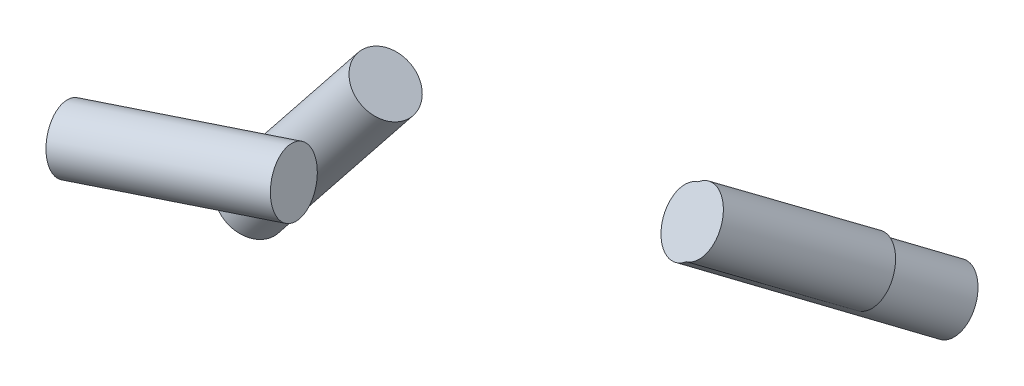
ISO-10303-21;
HEADER;
FILE_DESCRIPTION(('STEP AP214'),'2;1');
FILE_NAME('part.step','',(''),(''),'','','');
FILE_SCHEMA(('AUTOMOTIVE_DESIGN { 1 0 10303 214 1 1 1 1 }'));
ENDSEC;
DATA;
#1=APPLICATION_CONTEXT('core data for automotive mechanical design processes');
#2=APPLICATION_PROTOCOL_DEFINITION('international standard','automotive_design',2000,#1);
#3=PRODUCT_CONTEXT('',#1,'mechanical');
#4=PRODUCT('Part','Part','',(#3));
#5=PRODUCT_RELATED_PRODUCT_CATEGORY('part','',(#4));
#6=PRODUCT_DEFINITION_FORMATION('','',#4);
#7=PRODUCT_DEFINITION_CONTEXT('part definition',#1,'design');
#8=PRODUCT_DEFINITION('design','',#6,#7);
#9=PRODUCT_DEFINITION_SHAPE('','',#8);
#10=(LENGTH_UNIT() NAMED_UNIT(*) SI_UNIT(.MILLI.,.METRE.));
#11=(NAMED_UNIT(*) PLANE_ANGLE_UNIT() SI_UNIT($,.RADIAN.));
#12=(NAMED_UNIT(*) SI_UNIT($,.STERADIAN.) SOLID_ANGLE_UNIT());
#13=UNCERTAINTY_MEASURE_WITH_UNIT(LENGTH_MEASURE(1.E-05),#10,'distance_accuracy_value','');
#14=(GEOMETRIC_REPRESENTATION_CONTEXT(3) GLOBAL_UNCERTAINTY_ASSIGNED_CONTEXT((#13)) GLOBAL_UNIT_ASSIGNED_CONTEXT((#10,
#11,#12)) REPRESENTATION_CONTEXT('',''));
#15=CARTESIAN_POINT('',(0.,0.,0.));
#16=DIRECTION('',(0.,0.,1.));
#17=DIRECTION('',(1.,0.,0.));
#18=AXIS2_PLACEMENT_3D('',#15,#16,#17);
#19=CARTESIAN_POINT('',(-92.6291912,-174.831742,-42.383));
#20=DIRECTION('',(0.30680222447323,-0.522292458953053,-0.79566511949378));
#21=DIRECTION('',(0.,0.835981770105138,-0.548757214122858));
#22=AXIS2_PLACEMENT_3D('',#19,#20,#21);
#23=PLANE('',#22);
#24=CARTESIAN_POINT('',(-92.6291912,-174.831742,-42.383));
#25=DIRECTION('',(0.30680222447323,-0.522292458953053,-0.79566511949378));
#26=DIRECTION('',(0.,0.835981770105138,-0.548757214122858));
#27=AXIS2_PLACEMENT_3D('',#24,#25,#26);
#28=CIRCLE('',#27,7.);
#29=CARTESIAN_POINT('',(-88.6902827322016,-178.854608799325,-38.2234876731525));
#30=VERTEX_POINT('',#29);
#31=CARTESIAN_POINT('',(-94.2249714768449,-169.432487892897,-46.5425120380837));
#32=VERTEX_POINT('',#31);
#33=EDGE_CURVE('E104',#30,#32,#28,.T.);
#34=ORIENTED_EDGE('',*,*,#33,.F.);
#35=CARTESIAN_POINT('',(-90.2859185106159,-173.455269811689,-42.3829997112642));
#36=DIRECTION('',(0.30680222447323,-0.522292458953053,-0.79566511949378));
#37=DIRECTION('',(-0.402994747847101,0.686059921289392,-0.605736756031896));
#38=AXIS2_PLACEMENT_3D('',#35,#36,#37);
#39=ELLIPSE('',#38,7.00003380497109,7.00000000000001);
#40=EDGE_CURVE('E111',#30,#32,#39,.F.);
#41=ORIENTED_EDGE('',*,*,#40,.T.);
#42=EDGE_LOOP('',(#34,#41));
#43=FACE_BOUND('',#42,.T.);
#44=ADVANCED_FACE('F76',(#43),#23,.F.);
#45=CARTESIAN_POINT('',(-75.2253056,-204.459683,-87.5184769));
#46=DIRECTION('',(0.30680222447323,-0.522292458953053,-0.79566511949378));
#47=DIRECTION('',(0.,0.835981770105138,-0.548757214122858));
#48=AXIS2_PLACEMENT_3D('',#45,#46,#47);
#49=PLANE('',#48);
#50=CARTESIAN_POINT('',(-75.2253056,-204.459683,-87.5184769));
#51=DIRECTION('',(0.30680222447323,-0.522292458953053,-0.79566511949378));
#52=DIRECTION('',(0.,0.835981770105138,-0.548757214122858));
#53=AXIS2_PLACEMENT_3D('',#50,#51,#52);
#54=CIRCLE('',#53,7.);
#55=CARTESIAN_POINT('',(-75.2253056,-198.607810609264,-91.35977739886));
#56=VERTEX_POINT('',#55);
#57=EDGE_CURVE('E110',#56,#56,#54,.T.);
#58=ORIENTED_EDGE('',*,*,#57,.T.);
#59=EDGE_LOOP('',(#58));
#60=FACE_BOUND('',#59,.T.);
#61=ADVANCED_FACE('F138',(#60),#49,.T.);
#62=CARTESIAN_POINT('',(-92.6291912,-174.831742,-42.383));
#63=DIRECTION('',(0.30680222447323,-0.522292458953052,-0.795665119493781));
#64=DIRECTION('',(0.,0.835981770105138,-0.548757214122857));
#65=AXIS2_PLACEMENT_3D('',#62,#63,#64);
#66=CYLINDRICAL_SURFACE('',#65,7.);
#67=CARTESIAN_POINT('',(-88.6902827322015,-178.854608799325,-38.2234876731525));
#68=CARTESIAN_POINT('',(-87.2299099746158,-181.268360821528,-41.9408644897331));
#69=CARTESIAN_POINT('',(-85.7696605328904,-183.681903025571,-45.6584260047991));
#70=CARTESIAN_POINT('',(-81.9200519234787,-190.044705083631,-55.4603080896262));
#71=CARTESIAN_POINT('',(-79.5309200072474,-193.993626513858,-61.5449376035297));
#72=CARTESIAN_POINT('',(-77.1396935889792,-197.946192832997,-67.636452114989));
#73=CARTESIAN_POINT('',(-77.1371833865707,-197.950342060315,-67.6428467158402));
#74=CARTESIAN_POINT('',(-77.1346731846213,-197.954491287075,-67.6492413172329));
#75=B_SPLINE_CURVE_WITH_KNOTS('',3,(#67,#68,#69,#70,#71,#72,#73,#74),.UNSPECIFIED.,.F.,.F.,(4,2,
2,4),(0.,14.0000000298617,36.9111724824559,36.9352488840057),.UNSPECIFIED.);
#76=CARTESIAN_POINT('',(-77.1346731846158,-197.954491287071,-67.6492413172339));
#77=VERTEX_POINT('',#76);
#78=EDGE_CURVE('E13',#30,#77,#75,.T.);
#79=ORIENTED_EDGE('',*,*,#78,.F.);
#80=ORIENTED_EDGE('',*,*,#33,.T.);
#81=CARTESIAN_POINT('',(-83.1767073308499,-188.812214646941,-75.926604662793));
#82=CARTESIAN_POINT('',(-84.5746098793784,-186.360285476204,-72.2101964485685));
#83=CARTESIAN_POINT('',(-85.9723717858542,-183.908554634613,-68.4936045414729));
#84=CARTESIAN_POINT('',(-89.6553619119176,-177.448313747543,-58.6992144703385));
#85=CARTESIAN_POINT('',(-91.9403547207735,-173.44013567112,-52.6211088358643));
#86=CARTESIAN_POINT('',(-94.2249714768449,-169.432487892897,-46.5425120380837));
#87=B_SPLINE_CURVE_WITH_KNOTS('',3,(#81,#82,#83,#84,#85,#86),.UNSPECIFIED.,.F.,.F.,(4,2,4),(0.,
14.000000029866,36.8925854145277),.UNSPECIFIED.);
#88=CARTESIAN_POINT('',(-83.1767073308499,-188.812214646941,-75.926604662793));
#89=VERTEX_POINT('',#88);
#90=EDGE_CURVE('E99',#89,#32,#87,.T.);
#91=ORIENTED_EDGE('',*,*,#90,.F.);
#92=CARTESIAN_POINT('',(-81.3042270092602,-194.11107872871,-71.7533182940059));
#93=DIRECTION('',(0.305548311077003,-0.520157791657343,-0.79754379276385));
#94=DIRECTION('',(0.403946285206575,-0.687679794713251,0.603261053451115));
#95=AXIS2_PLACEMENT_3D('',#92,#93,#94);
#96=ELLIPSE('',#95,7.00003380497109,7.);
#97=EDGE_CURVE('E89',#77,#89,#96,.F.);
#98=ORIENTED_EDGE('',*,*,#97,.F.);
#99=EDGE_LOOP('',(#79,#80,#91,#98));
#100=FACE_BOUND('',#99,.T.);
#101=ORIENTED_EDGE('',*,*,#57,.F.);
#102=EDGE_LOOP('',(#101));
#103=FACE_BOUND('',#102,.T.);
#104=ADVANCED_FACE('F105',(#100,#103),#66,.T.);
#105=CARTESIAN_POINT('',(-79.007294399999,-192.655717,-71.8225231000013));
#106=DIRECTION('',(0.305548311077003,-0.520157791657343,-0.79754379276385));
#107=DIRECTION('',(0.,0.837600728553223,-0.546282911619163));
#108=AXIS2_PLACEMENT_3D('',#105,#106,#107);
#109=PLANE('',#108);
#110=CARTESIAN_POINT('',(-79.007294399999,-192.655717,-71.8225231000013));
#111=DIRECTION('',(0.305548311077003,-0.520157791657343,-0.79754379276385));
#112=DIRECTION('',(0.,0.837600728553223,-0.546282911619163));
#113=AXIS2_PLACEMENT_3D('',#110,#111,#112);
#114=CIRCLE('',#113,7.00000000000001);
#115=EDGE_CURVE('E117',#89,#77,#114,.T.);
#116=ORIENTED_EDGE('',*,*,#115,.T.);
#117=ORIENTED_EDGE('',*,*,#97,.T.);
#118=EDGE_LOOP('',(#116,#117));
#119=FACE_BOUND('',#118,.T.);
#120=ADVANCED_FACE('F131',(#119),#109,.T.);
#121=CARTESIAN_POINT('',(-90.5981153249464,-172.923793774619,-41.5681019606851));
#122=DIRECTION('',(0.305548311077002,-0.520157791657342,-0.797543792763851));
#123=DIRECTION('',(0.,0.837600728553224,-0.546282911619162));
#124=AXIS2_PLACEMENT_3D('',#121,#122,#123);
#125=CYLINDRICAL_SURFACE('',#124,7.00000000000001);
#126=ORIENTED_EDGE('',*,*,#40,.F.);
#127=ORIENTED_EDGE('',*,*,#78,.T.);
#128=ORIENTED_EDGE('',*,*,#115,.F.);
#129=ORIENTED_EDGE('',*,*,#90,.T.);
#130=EDGE_LOOP('',(#126,#127,#128,#129));
#131=FACE_BOUND('',#130,.T.);
#132=ADVANCED_FACE('F115',(#131),#125,.T.);
#133=CLOSED_SHELL('',(#44,#61,#104,#120,#132));
#134=MANIFOLD_SOLID_BREP('B2',#133);
#135=CARTESIAN_POINT('',(-210.980497,-238.523155,-67.7546604));
#136=DIRECTION('',(-0.961206895835901,-0.178515476938392,0.210270130762719));
#137=DIRECTION('',(0.213702816900093,0.,0.976898718419144));
#138=AXIS2_PLACEMENT_3D('',#135,#136,#137);
#139=PLANE('',#138);
#140=CARTESIAN_POINT('',(-210.980497,-238.523155,-67.7546604));
#141=DIRECTION('',(-0.961206895835901,-0.178515476938392,0.210270130762719));
#142=DIRECTION('',(0.213702816900093,0.,0.976898718419144));
#143=AXIS2_PLACEMENT_3D('',#140,#141,#142);
#144=CIRCLE('',#143,7.);
#145=CARTESIAN_POINT('',(-209.484577281699,-238.523155,-60.916369371066));
#146=VERTEX_POINT('',#145);
#147=EDGE_CURVE('E211',#146,#146,#144,.T.);
#148=ORIENTED_EDGE('',*,*,#147,.F.);
#149=EDGE_LOOP('',(#148));
#150=FACE_BOUND('',#149,.T.);
#151=ADVANCED_FACE('F205',(#150),#139,.F.);
#152=CARTESIAN_POINT('',(-254.500188,-246.605638,-58.2344508));
#153=DIRECTION('',(-0.961206895835901,-0.178515476938392,0.210270130762719));
#154=DIRECTION('',(0.213702816900093,0.,0.976898718419144));
#155=AXIS2_PLACEMENT_3D('',#152,#153,#154);
#156=PLANE('',#155);
#157=CARTESIAN_POINT('',(-254.500188,-246.605638,-58.2344508));
#158=DIRECTION('',(-0.961206895835901,-0.178515476938392,0.210270130762719));
#159=DIRECTION('',(0.213702816900093,0.,0.976898718419144));
#160=AXIS2_PLACEMENT_3D('',#157,#158,#159);
#161=CIRCLE('',#160,7.);
#162=CARTESIAN_POINT('',(-253.004268281699,-246.605638,-51.396159771066));
#163=VERTEX_POINT('',#162);
#164=EDGE_CURVE('E75',#163,#163,#161,.T.);
#165=ORIENTED_EDGE('',*,*,#164,.T.);
#166=EDGE_LOOP('',(#165));
#167=FACE_BOUND('',#166,.T.);
#168=ADVANCED_FACE('F220',(#167),#156,.T.);
#169=CARTESIAN_POINT('',(-210.980497,-238.523155,-67.7546604));
#170=DIRECTION('',(-0.9612068958359,-0.178515476938392,0.210270130762719));
#171=DIRECTION('',(0.213702816900093,0.,0.976898718419144));
#172=AXIS2_PLACEMENT_3D('',#169,#170,#171);
#173=CYLINDRICAL_SURFACE('',#172,7.);
#174=ORIENTED_EDGE('',*,*,#164,.F.);
#175=EDGE_LOOP('',(#174));
#176=FACE_BOUND('',#175,.T.);
#177=ORIENTED_EDGE('',*,*,#147,.T.);
#178=EDGE_LOOP('',(#177));
#179=FACE_BOUND('',#178,.T.);
#180=ADVANCED_FACE('F217',(#176,#179),#173,.T.);
#181=CLOSED_SHELL('',(#151,#168,#180));
#182=MANIFOLD_SOLID_BREP('B7',#181);
#183=CARTESIAN_POINT('',(-217.671213,-235.931172,-96.1393535));
#184=DIRECTION('',(-0.612437587886598,-0.787189398401177,0.0724779413921193));
#185=DIRECTION('',(0.789265153444726,-0.614052536480286,0.));
#186=AXIS2_PLACEMENT_3D('',#183,#184,#185);
#187=PLANE('',#186);
#188=CARTESIAN_POINT('',(-217.671213,-235.931172,-96.1393535));
#189=DIRECTION('',(-0.612437587886598,-0.787189398401177,0.0724779413921193));
#190=DIRECTION('',(0.789265153444726,-0.614052536480286,0.));
#191=AXIS2_PLACEMENT_3D('',#188,#189,#190);
#192=CIRCLE('',#191,7.);
#193=CARTESIAN_POINT('',(-212.146356925887,-240.229539755362,-96.1393535));
#194=VERTEX_POINT('',#193);
#195=EDGE_CURVE('E264',#194,#194,#192,.T.);
#196=ORIENTED_EDGE('',*,*,#195,.F.);
#197=EDGE_LOOP('',(#196));
#198=FACE_BOUND('',#197,.T.);
#199=ADVANCED_FACE('F258',(#198),#187,.F.);
#200=CARTESIAN_POINT('',(-246.179812,-272.574362,-92.7655492));
#201=DIRECTION('',(-0.612437587886598,-0.787189398401177,0.0724779413921193));
#202=DIRECTION('',(0.789265153444726,-0.614052536480286,0.));
#203=AXIS2_PLACEMENT_3D('',#200,#201,#202);
#204=PLANE('',#203);
#205=CARTESIAN_POINT('',(-246.179812,-272.574362,-92.7655492));
#206=DIRECTION('',(-0.612437587886598,-0.787189398401177,0.0724779413921193));
#207=DIRECTION('',(0.789265153444726,-0.614052536480286,0.));
#208=AXIS2_PLACEMENT_3D('',#205,#206,#207);
#209=CIRCLE('',#208,7.);
#210=CARTESIAN_POINT('',(-240.654955925887,-276.872729755362,-92.7655492));
#211=VERTEX_POINT('',#210);
#212=EDGE_CURVE('E204',#211,#211,#209,.T.);
#213=ORIENTED_EDGE('',*,*,#212,.T.);
#214=EDGE_LOOP('',(#213));
#215=FACE_BOUND('',#214,.T.);
#216=ADVANCED_FACE('F273',(#215),#204,.T.);
#217=CARTESIAN_POINT('',(-217.671213,-235.931172,-96.1393535));
#218=DIRECTION('',(-0.612437587886599,-0.787189398401176,0.0724779413921193));
#219=DIRECTION('',(0.789265153444725,-0.614052536480288,0.));
#220=AXIS2_PLACEMENT_3D('',#217,#218,#219);
#221=CYLINDRICAL_SURFACE('',#220,7.);
#222=ORIENTED_EDGE('',*,*,#212,.F.);
#223=EDGE_LOOP('',(#222));
#224=FACE_BOUND('',#223,.T.);
#225=ORIENTED_EDGE('',*,*,#195,.T.);
#226=EDGE_LOOP('',(#225));
#227=FACE_BOUND('',#226,.T.);
#228=ADVANCED_FACE('F270',(#224,#227),#221,.T.);
#229=CLOSED_SHELL('',(#199,#216,#228));
#230=MANIFOLD_SOLID_BREP('B70',#229);
#231=ADVANCED_BREP_SHAPE_REPRESENTATION('',(#18,#134,#182,#230),#14);
#232=SHAPE_DEFINITION_REPRESENTATION(#9,#231);
ENDSEC;
END-ISO-10303-21;
